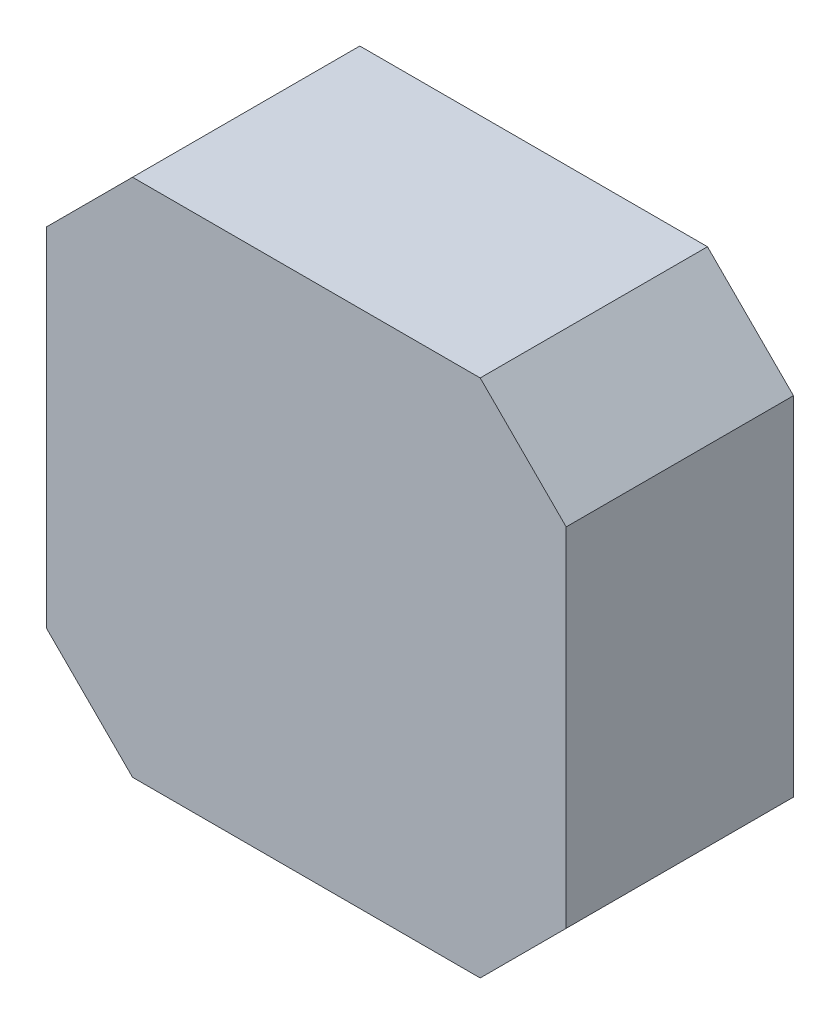
ISO-10303-21;
HEADER;
FILE_DESCRIPTION(('STEP AP214'),'2;1');
FILE_NAME('part.step','',(''),(''),'','','');
FILE_SCHEMA(('AUTOMOTIVE_DESIGN { 1 0 10303 214 1 1 1 1 }'));
ENDSEC;
DATA;
#1=APPLICATION_CONTEXT('core data for automotive mechanical design processes');
#2=APPLICATION_PROTOCOL_DEFINITION('international standard','automotive_design',2000,#1);
#3=PRODUCT_CONTEXT('',#1,'mechanical');
#4=PRODUCT('Part','Part','',(#3));
#5=PRODUCT_RELATED_PRODUCT_CATEGORY('part','',(#4));
#6=PRODUCT_DEFINITION_FORMATION('','',#4);
#7=PRODUCT_DEFINITION_CONTEXT('part definition',#1,'design');
#8=PRODUCT_DEFINITION('design','',#6,#7);
#9=PRODUCT_DEFINITION_SHAPE('','',#8);
#10=(LENGTH_UNIT() NAMED_UNIT(*) SI_UNIT(.MILLI.,.METRE.));
#11=(NAMED_UNIT(*) PLANE_ANGLE_UNIT() SI_UNIT($,.RADIAN.));
#12=(NAMED_UNIT(*) SI_UNIT($,.STERADIAN.) SOLID_ANGLE_UNIT());
#13=UNCERTAINTY_MEASURE_WITH_UNIT(LENGTH_MEASURE(1.E-05),#10,'distance_accuracy_value','');
#14=(GEOMETRIC_REPRESENTATION_CONTEXT(3) GLOBAL_UNCERTAINTY_ASSIGNED_CONTEXT((#13)) GLOBAL_UNIT_ASSIGNED_CONTEXT((#10,
#11,#12)) REPRESENTATION_CONTEXT('',''));
#15=CARTESIAN_POINT('',(0.,0.,0.));
#16=DIRECTION('',(0.,0.,1.));
#17=DIRECTION('',(1.,0.,0.));
#18=AXIS2_PLACEMENT_3D('',#15,#16,#17);
#19=CARTESIAN_POINT('',(-21.15,14.15,24.));
#20=DIRECTION('',(1.,0.,0.));
#21=DIRECTION('',(0.,0.,-1.));
#22=AXIS2_PLACEMENT_3D('',#19,#20,#21);
#23=PLANE('',#22);
#24=DIRECTION('',(0.,0.,1.));
#25=VECTOR('',#24,1.);
#26=CARTESIAN_POINT('',(-21.15,14.15,0.));
#27=LINE('',#26,#25);
#28=CARTESIAN_POINT('',(-21.15,14.15,0.));
#29=VERTEX_POINT('',#28);
#30=CARTESIAN_POINT('',(-21.15,14.15,18.5));
#31=VERTEX_POINT('',#30);
#32=EDGE_CURVE('E132',#29,#31,#27,.T.);
#33=ORIENTED_EDGE('',*,*,#32,.F.);
#34=DIRECTION('',(0.,1.,0.));
#35=VECTOR('',#34,1.);
#36=CARTESIAN_POINT('',(-21.15,-14.15,0.));
#37=LINE('',#36,#35);
#38=CARTESIAN_POINT('',(-21.15,-14.15,0.));
#39=VERTEX_POINT('',#38);
#40=EDGE_CURVE('E36',#39,#29,#37,.T.);
#41=ORIENTED_EDGE('',*,*,#40,.F.);
#42=DIRECTION('',(0.,0.,1.));
#43=VECTOR('',#42,1.);
#44=CARTESIAN_POINT('',(-21.15,-14.15,0.));
#45=LINE('',#44,#43);
#46=CARTESIAN_POINT('',(-21.15,-14.15,18.5));
#47=VERTEX_POINT('',#46);
#48=EDGE_CURVE('E11',#39,#47,#45,.T.);
#49=ORIENTED_EDGE('',*,*,#48,.T.);
#50=DIRECTION('',(0.,1.,0.));
#51=VECTOR('',#50,1.);
#52=CARTESIAN_POINT('',(-21.15,-14.15,18.5));
#53=LINE('',#52,#51);
#54=EDGE_CURVE('E27',#47,#31,#53,.T.);
#55=ORIENTED_EDGE('',*,*,#54,.T.);
#56=EDGE_LOOP('',(#33,#41,#49,#55));
#57=FACE_BOUND('',#56,.T.);
#58=ADVANCED_FACE('F17',(#57),#23,.F.);
#59=CARTESIAN_POINT('',(0.,0.,18.5));
#60=DIRECTION('',(0.,0.,1.));
#61=DIRECTION('',(1.,0.,0.));
#62=AXIS2_PLACEMENT_3D('',#59,#60,#61);
#63=PLANE('',#62);
#64=DIRECTION('',(-0.707106781186548,0.707106781186548,0.));
#65=VECTOR('',#64,1.);
#66=CARTESIAN_POINT('',(-14.15,-21.15,18.5));
#67=LINE('',#66,#65);
#68=CARTESIAN_POINT('',(-14.15,-21.15,18.5));
#69=VERTEX_POINT('',#68);
#70=EDGE_CURVE('E101',#69,#47,#67,.T.);
#71=ORIENTED_EDGE('',*,*,#70,.F.);
#72=DIRECTION('',(1.,0.,0.));
#73=VECTOR('',#72,1.);
#74=CARTESIAN_POINT('',(-14.15,-21.15,18.5));
#75=LINE('',#74,#73);
#76=CARTESIAN_POINT('',(14.15,-21.15,18.5));
#77=VERTEX_POINT('',#76);
#78=EDGE_CURVE('E100',#69,#77,#75,.T.);
#79=ORIENTED_EDGE('',*,*,#78,.T.);
#80=DIRECTION('',(-0.707106781186548,-0.707106781186548,0.));
#81=VECTOR('',#80,1.);
#82=CARTESIAN_POINT('',(21.15,-14.15,18.5));
#83=LINE('',#82,#81);
#84=CARTESIAN_POINT('',(21.15,-14.15,18.5));
#85=VERTEX_POINT('',#84);
#86=EDGE_CURVE('E110',#85,#77,#83,.T.);
#87=ORIENTED_EDGE('',*,*,#86,.F.);
#88=DIRECTION('',(0.,-1.,0.));
#89=VECTOR('',#88,1.);
#90=CARTESIAN_POINT('',(21.15,14.15,18.5));
#91=LINE('',#90,#89);
#92=CARTESIAN_POINT('',(21.15,14.15,18.5));
#93=VERTEX_POINT('',#92);
#94=EDGE_CURVE('E113',#93,#85,#91,.T.);
#95=ORIENTED_EDGE('',*,*,#94,.F.);
#96=DIRECTION('',(0.707106781186548,-0.707106781186548,0.));
#97=VECTOR('',#96,1.);
#98=CARTESIAN_POINT('',(14.15,21.15,18.5));
#99=LINE('',#98,#97);
#100=CARTESIAN_POINT('',(14.15,21.15,18.5));
#101=VERTEX_POINT('',#100);
#102=EDGE_CURVE('E122',#101,#93,#99,.T.);
#103=ORIENTED_EDGE('',*,*,#102,.F.);
#104=DIRECTION('',(1.,0.,0.));
#105=VECTOR('',#104,1.);
#106=CARTESIAN_POINT('',(-14.15,21.15,18.5));
#107=LINE('',#106,#105);
#108=CARTESIAN_POINT('',(-14.15,21.15,18.5));
#109=VERTEX_POINT('',#108);
#110=EDGE_CURVE('E127',#109,#101,#107,.T.);
#111=ORIENTED_EDGE('',*,*,#110,.F.);
#112=DIRECTION('',(0.707106781186548,0.707106781186548,0.));
#113=VECTOR('',#112,1.);
#114=CARTESIAN_POINT('',(-21.15,14.15,18.5));
#115=LINE('',#114,#113);
#116=EDGE_CURVE('E129',#31,#109,#115,.T.);
#117=ORIENTED_EDGE('',*,*,#116,.F.);
#118=ORIENTED_EDGE('',*,*,#54,.F.);
#119=EDGE_LOOP('',(#71,#79,#87,#95,#103,#111,#117,#118));
#120=FACE_BOUND('',#119,.T.);
#121=ADVANCED_FACE('F149',(#120),#63,.T.);
#122=CARTESIAN_POINT('',(-14.15,21.15,24.));
#123=DIRECTION('',(0.707106781186548,-0.707106781186548,0.));
#124=DIRECTION('',(0.707106781186548,0.707106781186548,0.));
#125=AXIS2_PLACEMENT_3D('',#122,#123,#124);
#126=PLANE('',#125);
#127=DIRECTION('',(0.,0.,1.));
#128=VECTOR('',#127,1.);
#129=CARTESIAN_POINT('',(-14.15,21.15,0.));
#130=LINE('',#129,#128);
#131=CARTESIAN_POINT('',(-14.15,21.15,0.));
#132=VERTEX_POINT('',#131);
#133=EDGE_CURVE('E126',#132,#109,#130,.T.);
#134=ORIENTED_EDGE('',*,*,#133,.F.);
#135=DIRECTION('',(0.707106781186548,0.707106781186548,0.));
#136=VECTOR('',#135,1.);
#137=CARTESIAN_POINT('',(-21.15,14.15,0.));
#138=LINE('',#137,#136);
#139=EDGE_CURVE('E133',#29,#132,#138,.T.);
#140=ORIENTED_EDGE('',*,*,#139,.F.);
#141=ORIENTED_EDGE('',*,*,#32,.T.);
#142=ORIENTED_EDGE('',*,*,#116,.T.);
#143=EDGE_LOOP('',(#134,#140,#141,#142));
#144=FACE_BOUND('',#143,.T.);
#145=ADVANCED_FACE('F155',(#144),#126,.F.);
#146=CARTESIAN_POINT('',(0.,0.,0.));
#147=DIRECTION('',(0.,0.,1.));
#148=DIRECTION('',(1.,0.,0.));
#149=AXIS2_PLACEMENT_3D('',#146,#147,#148);
#150=PLANE('',#149);
#151=ORIENTED_EDGE('',*,*,#139,.T.);
#152=DIRECTION('',(1.,0.,0.));
#153=VECTOR('',#152,1.);
#154=CARTESIAN_POINT('',(-14.15,21.15,0.));
#155=LINE('',#154,#153);
#156=CARTESIAN_POINT('',(14.15,21.15,0.));
#157=VERTEX_POINT('',#156);
#158=EDGE_CURVE('E137',#132,#157,#155,.T.);
#159=ORIENTED_EDGE('',*,*,#158,.T.);
#160=DIRECTION('',(0.707106781186548,-0.707106781186548,0.));
#161=VECTOR('',#160,1.);
#162=CARTESIAN_POINT('',(14.15,21.15,0.));
#163=LINE('',#162,#161);
#164=CARTESIAN_POINT('',(21.15,14.15,0.));
#165=VERTEX_POINT('',#164);
#166=EDGE_CURVE('E140',#157,#165,#163,.T.);
#167=ORIENTED_EDGE('',*,*,#166,.T.);
#168=DIRECTION('',(0.,-1.,0.));
#169=VECTOR('',#168,1.);
#170=CARTESIAN_POINT('',(21.15,14.15,0.));
#171=LINE('',#170,#169);
#172=CARTESIAN_POINT('',(21.15,-14.15,0.));
#173=VERTEX_POINT('',#172);
#174=EDGE_CURVE('E143',#165,#173,#171,.T.);
#175=ORIENTED_EDGE('',*,*,#174,.T.);
#176=DIRECTION('',(-0.707106781186548,-0.707106781186548,0.));
#177=VECTOR('',#176,1.);
#178=CARTESIAN_POINT('',(21.15,-14.15,0.));
#179=LINE('',#178,#177);
#180=CARTESIAN_POINT('',(14.15,-21.15,0.));
#181=VERTEX_POINT('',#180);
#182=EDGE_CURVE('E94',#173,#181,#179,.T.);
#183=ORIENTED_EDGE('',*,*,#182,.T.);
#184=DIRECTION('',(-1.,0.,0.));
#185=VECTOR('',#184,1.);
#186=CARTESIAN_POINT('',(14.15,-21.15,0.));
#187=LINE('',#186,#185);
#188=CARTESIAN_POINT('',(-14.15,-21.15,0.));
#189=VERTEX_POINT('',#188);
#190=EDGE_CURVE('E81',#181,#189,#187,.T.);
#191=ORIENTED_EDGE('',*,*,#190,.T.);
#192=DIRECTION('',(-0.707106781186548,0.707106781186548,0.));
#193=VECTOR('',#192,1.);
#194=CARTESIAN_POINT('',(-14.15,-21.15,0.));
#195=LINE('',#194,#193);
#196=EDGE_CURVE('E87',#189,#39,#195,.T.);
#197=ORIENTED_EDGE('',*,*,#196,.T.);
#198=ORIENTED_EDGE('',*,*,#40,.T.);
#199=EDGE_LOOP('',(#151,#159,#167,#175,#183,#191,#197,#198));
#200=FACE_BOUND('',#199,.T.);
#201=ADVANCED_FACE('F92',(#200),#150,.F.);
#202=CARTESIAN_POINT('',(-21.15,-14.15,24.));
#203=DIRECTION('',(0.707106781186548,0.707106781186548,0.));
#204=DIRECTION('',(-0.707106781186548,0.707106781186548,0.));
#205=AXIS2_PLACEMENT_3D('',#202,#203,#204);
#206=PLANE('',#205);
#207=ORIENTED_EDGE('',*,*,#48,.F.);
#208=ORIENTED_EDGE('',*,*,#196,.F.);
#209=DIRECTION('',(0.,0.,1.));
#210=VECTOR('',#209,1.);
#211=CARTESIAN_POINT('',(-14.15,-21.15,0.));
#212=LINE('',#211,#210);
#213=EDGE_CURVE('E90',#189,#69,#212,.T.);
#214=ORIENTED_EDGE('',*,*,#213,.T.);
#215=ORIENTED_EDGE('',*,*,#70,.T.);
#216=EDGE_LOOP('',(#207,#208,#214,#215));
#217=FACE_BOUND('',#216,.T.);
#218=ADVANCED_FACE('F88',(#217),#206,.F.);
#219=CARTESIAN_POINT('',(-14.15,-21.15,24.));
#220=DIRECTION('',(0.,1.,0.));
#221=DIRECTION('',(0.,0.,1.));
#222=AXIS2_PLACEMENT_3D('',#219,#220,#221);
#223=PLANE('',#222);
#224=ORIENTED_EDGE('',*,*,#213,.F.);
#225=ORIENTED_EDGE('',*,*,#190,.F.);
#226=DIRECTION('',(0.,0.,1.));
#227=VECTOR('',#226,1.);
#228=CARTESIAN_POINT('',(14.15,-21.15,0.));
#229=LINE('',#228,#227);
#230=EDGE_CURVE('E104',#181,#77,#229,.T.);
#231=ORIENTED_EDGE('',*,*,#230,.T.);
#232=ORIENTED_EDGE('',*,*,#78,.F.);
#233=EDGE_LOOP('',(#224,#225,#231,#232));
#234=FACE_BOUND('',#233,.T.);
#235=ADVANCED_FACE('F98',(#234),#223,.F.);
#236=CARTESIAN_POINT('',(21.15,-14.15,24.));
#237=DIRECTION('',(-0.707106781186548,0.707106781186548,0.));
#238=DIRECTION('',(-0.707106781186548,-0.707106781186548,0.));
#239=AXIS2_PLACEMENT_3D('',#236,#237,#238);
#240=PLANE('',#239);
#241=ORIENTED_EDGE('',*,*,#230,.F.);
#242=ORIENTED_EDGE('',*,*,#182,.F.);
#243=DIRECTION('',(0.,0.,1.));
#244=VECTOR('',#243,1.);
#245=CARTESIAN_POINT('',(21.15,-14.15,0.));
#246=LINE('',#245,#244);
#247=EDGE_CURVE('E108',#173,#85,#246,.T.);
#248=ORIENTED_EDGE('',*,*,#247,.T.);
#249=ORIENTED_EDGE('',*,*,#86,.T.);
#250=EDGE_LOOP('',(#241,#242,#248,#249));
#251=FACE_BOUND('',#250,.T.);
#252=ADVANCED_FACE('F147',(#251),#240,.F.);
#253=CARTESIAN_POINT('',(21.15,14.15,24.));
#254=DIRECTION('',(-1.,0.,0.));
#255=DIRECTION('',(0.,-1.,0.));
#256=AXIS2_PLACEMENT_3D('',#253,#254,#255);
#257=PLANE('',#256);
#258=ORIENTED_EDGE('',*,*,#247,.F.);
#259=ORIENTED_EDGE('',*,*,#174,.F.);
#260=DIRECTION('',(0.,0.,1.));
#261=VECTOR('',#260,1.);
#262=CARTESIAN_POINT('',(21.15,14.15,0.));
#263=LINE('',#262,#261);
#264=EDGE_CURVE('E111',#165,#93,#263,.T.);
#265=ORIENTED_EDGE('',*,*,#264,.T.);
#266=ORIENTED_EDGE('',*,*,#94,.T.);
#267=EDGE_LOOP('',(#258,#259,#265,#266));
#268=FACE_BOUND('',#267,.T.);
#269=ADVANCED_FACE('F145',(#268),#257,.F.);
#270=CARTESIAN_POINT('',(14.15,21.15,24.));
#271=DIRECTION('',(-0.707106781186548,-0.707106781186548,0.));
#272=DIRECTION('',(0.707106781186548,-0.707106781186548,0.));
#273=AXIS2_PLACEMENT_3D('',#270,#271,#272);
#274=PLANE('',#273);
#275=ORIENTED_EDGE('',*,*,#264,.F.);
#276=ORIENTED_EDGE('',*,*,#166,.F.);
#277=DIRECTION('',(0.,0.,1.));
#278=VECTOR('',#277,1.);
#279=CARTESIAN_POINT('',(14.15,21.15,0.));
#280=LINE('',#279,#278);
#281=EDGE_CURVE('E21',#157,#101,#280,.T.);
#282=ORIENTED_EDGE('',*,*,#281,.T.);
#283=ORIENTED_EDGE('',*,*,#102,.T.);
#284=EDGE_LOOP('',(#275,#276,#282,#283));
#285=FACE_BOUND('',#284,.T.);
#286=ADVANCED_FACE('F163',(#285),#274,.F.);
#287=CARTESIAN_POINT('',(-14.15,21.15,24.));
#288=DIRECTION('',(0.,-1.,0.));
#289=DIRECTION('',(0.,0.,-1.));
#290=AXIS2_PLACEMENT_3D('',#287,#288,#289);
#291=PLANE('',#290);
#292=ORIENTED_EDGE('',*,*,#281,.F.);
#293=ORIENTED_EDGE('',*,*,#158,.F.);
#294=ORIENTED_EDGE('',*,*,#133,.T.);
#295=ORIENTED_EDGE('',*,*,#110,.T.);
#296=EDGE_LOOP('',(#292,#293,#294,#295));
#297=FACE_BOUND('',#296,.T.);
#298=ADVANCED_FACE('F19',(#297),#291,.F.);
#299=CLOSED_SHELL('',(#58,#121,#145,#201,#218,#235,#252,#269,#286,#298));
#300=MANIFOLD_SOLID_BREP('B1',#299);
#301=ADVANCED_BREP_SHAPE_REPRESENTATION('',(#18,#300),#14);
#302=SHAPE_DEFINITION_REPRESENTATION(#9,#301);
ENDSEC;
END-ISO-10303-21;
